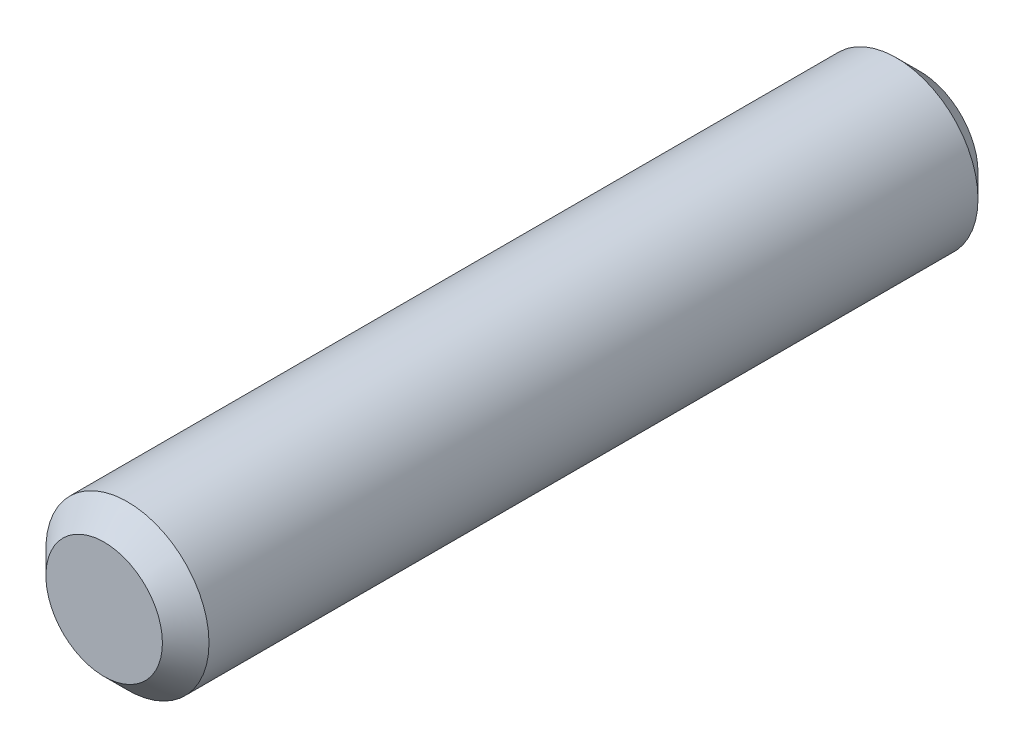
ISO-10303-21;
HEADER;
FILE_DESCRIPTION(('STEP AP214'),'2;1');
FILE_NAME('part.step','',(''),(''),'','','');
FILE_SCHEMA(('AUTOMOTIVE_DESIGN { 1 0 10303 214 1 1 1 1 }'));
ENDSEC;
DATA;
#1=APPLICATION_CONTEXT('core data for automotive mechanical design processes');
#2=APPLICATION_PROTOCOL_DEFINITION('international standard','automotive_design',2000,#1);
#3=PRODUCT_CONTEXT('',#1,'mechanical');
#4=PRODUCT('Part','Part','',(#3));
#5=PRODUCT_RELATED_PRODUCT_CATEGORY('part','',(#4));
#6=PRODUCT_DEFINITION_FORMATION('','',#4);
#7=PRODUCT_DEFINITION_CONTEXT('part definition',#1,'design');
#8=PRODUCT_DEFINITION('design','',#6,#7);
#9=PRODUCT_DEFINITION_SHAPE('','',#8);
#10=(LENGTH_UNIT() NAMED_UNIT(*) SI_UNIT(.MILLI.,.METRE.));
#11=(NAMED_UNIT(*) PLANE_ANGLE_UNIT() SI_UNIT($,.RADIAN.));
#12=(NAMED_UNIT(*) SI_UNIT($,.STERADIAN.) SOLID_ANGLE_UNIT());
#13=UNCERTAINTY_MEASURE_WITH_UNIT(LENGTH_MEASURE(1.E-05),#10,'distance_accuracy_value','');
#14=(GEOMETRIC_REPRESENTATION_CONTEXT(3) GLOBAL_UNCERTAINTY_ASSIGNED_CONTEXT((#13)) GLOBAL_UNIT_ASSIGNED_CONTEXT((#10,
#11,#12)) REPRESENTATION_CONTEXT('',''));
#15=CARTESIAN_POINT('',(0.,0.,0.));
#16=DIRECTION('',(0.,0.,1.));
#17=DIRECTION('',(1.,0.,0.));
#18=AXIS2_PLACEMENT_3D('',#15,#16,#17);
#19=CARTESIAN_POINT('',(0.,0.,35.));
#20=DIRECTION('',(0.,0.,-1.));
#21=DIRECTION('',(-1.,0.,0.));
#22=AXIS2_PLACEMENT_3D('',#19,#20,#21);
#23=CYLINDRICAL_SURFACE('',#22,7.);
#24=CARTESIAN_POINT('',(0.,0.,33.));
#25=DIRECTION('',(0.,0.,1.));
#26=DIRECTION('',(1.,0.,0.));
#27=AXIS2_PLACEMENT_3D('',#24,#25,#26);
#28=CIRCLE('',#27,7.);
#29=CARTESIAN_POINT('',(7.,0.,33.));
#30=VERTEX_POINT('',#29);
#31=EDGE_CURVE('E38',#30,#30,#28,.F.);
#32=ORIENTED_EDGE('',*,*,#31,.T.);
#33=EDGE_LOOP('',(#32));
#34=FACE_BOUND('',#33,.T.);
#35=CARTESIAN_POINT('',(0.,0.,-33.));
#36=DIRECTION('',(0.,0.,1.));
#37=DIRECTION('',(1.,0.,0.));
#38=AXIS2_PLACEMENT_3D('',#35,#36,#37);
#39=CIRCLE('',#38,7.);
#40=CARTESIAN_POINT('',(7.,0.,-33.));
#41=VERTEX_POINT('',#40);
#42=EDGE_CURVE('E42',#41,#41,#39,.T.);
#43=ORIENTED_EDGE('',*,*,#42,.T.);
#44=EDGE_LOOP('',(#43));
#45=FACE_BOUND('',#44,.T.);
#46=ADVANCED_FACE('F31',(#34,#45),#23,.T.);
#47=CARTESIAN_POINT('',(0.,0.,35.));
#48=DIRECTION('',(0.,0.,1.));
#49=DIRECTION('',(1.,0.,0.));
#50=AXIS2_PLACEMENT_3D('',#47,#48,#49);
#51=PLANE('',#50);
#52=CARTESIAN_POINT('',(0.,0.,35.));
#53=DIRECTION('',(0.,0.,1.));
#54=DIRECTION('',(1.,0.,0.));
#55=AXIS2_PLACEMENT_3D('',#52,#53,#54);
#56=CIRCLE('',#55,5.);
#57=CARTESIAN_POINT('',(5.,0.,35.));
#58=VERTEX_POINT('',#57);
#59=EDGE_CURVE('E46',#58,#58,#56,.T.);
#60=ORIENTED_EDGE('',*,*,#59,.T.);
#61=EDGE_LOOP('',(#60));
#62=FACE_BOUND('',#61,.T.);
#63=ADVANCED_FACE('F52',(#62),#51,.T.);
#64=CARTESIAN_POINT('',(0.,0.,-35.));
#65=DIRECTION('',(0.,0.,1.));
#66=DIRECTION('',(1.,0.,0.));
#67=AXIS2_PLACEMENT_3D('',#64,#65,#66);
#68=PLANE('',#67);
#69=CARTESIAN_POINT('',(0.,0.,-35.));
#70=DIRECTION('',(0.,0.,1.));
#71=DIRECTION('',(1.,0.,0.));
#72=AXIS2_PLACEMENT_3D('',#69,#70,#71);
#73=CIRCLE('',#72,4.99999999999998);
#74=CARTESIAN_POINT('',(4.99999999999998,0.,-35.));
#75=VERTEX_POINT('',#74);
#76=EDGE_CURVE('E10',#75,#75,#73,.F.);
#77=ORIENTED_EDGE('',*,*,#76,.T.);
#78=EDGE_LOOP('',(#77));
#79=FACE_BOUND('',#78,.T.);
#80=ADVANCED_FACE('F56',(#79),#68,.F.);
#81=CARTESIAN_POINT('',(0.,0.,35.));
#82=DIRECTION('',(0.,0.,-1.));
#83=DIRECTION('',(-1.,0.,0.));
#84=AXIS2_PLACEMENT_3D('',#81,#82,#83);
#85=CONICAL_SURFACE('',#84,5.,0.785398163397447);
#86=ORIENTED_EDGE('',*,*,#31,.F.);
#87=EDGE_LOOP('',(#86));
#88=FACE_BOUND('',#87,.T.);
#89=ORIENTED_EDGE('',*,*,#59,.F.);
#90=EDGE_LOOP('',(#89));
#91=FACE_BOUND('',#90,.T.);
#92=ADVANCED_FACE('F54',(#88,#91),#85,.T.);
#93=CARTESIAN_POINT('',(0.,0.,-33.));
#94=DIRECTION('',(0.,0.,1.));
#95=DIRECTION('',(1.,0.,0.));
#96=AXIS2_PLACEMENT_3D('',#93,#94,#95);
#97=CONICAL_SURFACE('',#96,7.,0.785398163397453);
#98=ORIENTED_EDGE('',*,*,#76,.F.);
#99=EDGE_LOOP('',(#98));
#100=FACE_BOUND('',#99,.T.);
#101=ORIENTED_EDGE('',*,*,#42,.F.);
#102=EDGE_LOOP('',(#101));
#103=FACE_BOUND('',#102,.T.);
#104=ADVANCED_FACE('F33',(#100,#103),#97,.T.);
#105=CLOSED_SHELL('',(#46,#63,#80,#92,#104));
#106=MANIFOLD_SOLID_BREP('B2',#105);
#107=ADVANCED_BREP_SHAPE_REPRESENTATION('',(#18,#106),#14);
#108=SHAPE_DEFINITION_REPRESENTATION(#9,#107);
ENDSEC;
END-ISO-10303-21;
